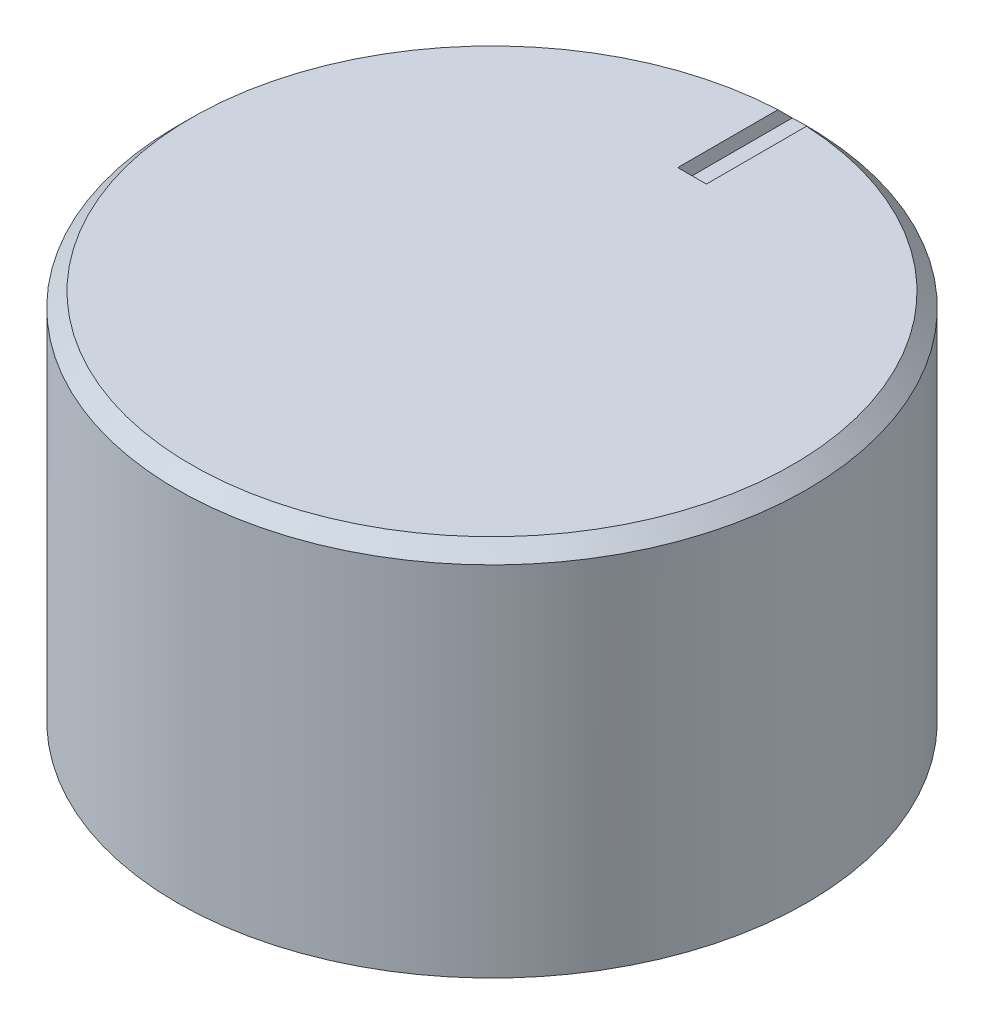
ISO-10303-21;
HEADER;
FILE_DESCRIPTION(('STEP AP214'),'2;1');
FILE_NAME('part.step','',(''),(''),'','','');
FILE_SCHEMA(('AUTOMOTIVE_DESIGN { 1 0 10303 214 1 1 1 1 }'));
ENDSEC;
DATA;
#1=APPLICATION_CONTEXT('core data for automotive mechanical design processes');
#2=APPLICATION_PROTOCOL_DEFINITION('international standard','automotive_design',2000,#1);
#3=PRODUCT_CONTEXT('',#1,'mechanical');
#4=PRODUCT('Part','Part','',(#3));
#5=PRODUCT_RELATED_PRODUCT_CATEGORY('part','',(#4));
#6=PRODUCT_DEFINITION_FORMATION('','',#4);
#7=PRODUCT_DEFINITION_CONTEXT('part definition',#1,'design');
#8=PRODUCT_DEFINITION('design','',#6,#7);
#9=PRODUCT_DEFINITION_SHAPE('','',#8);
#10=(LENGTH_UNIT() NAMED_UNIT(*) SI_UNIT(.MILLI.,.METRE.));
#11=(NAMED_UNIT(*) PLANE_ANGLE_UNIT() SI_UNIT($,.RADIAN.));
#12=(NAMED_UNIT(*) SI_UNIT($,.STERADIAN.) SOLID_ANGLE_UNIT());
#13=UNCERTAINTY_MEASURE_WITH_UNIT(LENGTH_MEASURE(1.E-05),#10,'distance_accuracy_value','');
#14=(GEOMETRIC_REPRESENTATION_CONTEXT(3) GLOBAL_UNCERTAINTY_ASSIGNED_CONTEXT((#13)) GLOBAL_UNIT_ASSIGNED_CONTEXT((#10,
#11,#12)) REPRESENTATION_CONTEXT('',''));
#15=CARTESIAN_POINT('',(0.,0.,0.));
#16=DIRECTION('',(0.,0.,1.));
#17=DIRECTION('',(1.,0.,0.));
#18=AXIS2_PLACEMENT_3D('',#15,#16,#17);
#19=CARTESIAN_POINT('',(0.,13.,0.));
#20=DIRECTION('',(0.,-1.,0.));
#21=DIRECTION('',(0.,0.,-1.));
#22=AXIS2_PLACEMENT_3D('',#19,#20,#21);
#23=CYLINDRICAL_SURFACE('',#22,11.);
#24=CARTESIAN_POINT('',(0.,12.5,0.));
#25=DIRECTION('',(0.,1.,0.));
#26=DIRECTION('',(0.,0.,1.));
#27=AXIS2_PLACEMENT_3D('',#24,#25,#26);
#28=CIRCLE('',#27,11.);
#29=CARTESIAN_POINT('',(0.5,12.5,-10.988630487918));
#30=VERTEX_POINT('',#29);
#31=CARTESIAN_POINT('',(-0.5,12.5,-10.988630487918));
#32=VERTEX_POINT('',#31);
#33=EDGE_CURVE('E93',#30,#32,#28,.T.);
#34=ORIENTED_EDGE('',*,*,#33,.F.);
#35=CARTESIAN_POINT('',(0.,12.5,0.));
#36=DIRECTION('',(0.,1.,0.));
#37=DIRECTION('',(0.,0.,1.));
#38=AXIS2_PLACEMENT_3D('',#35,#36,#37);
#39=CIRCLE('',#38,11.);
#40=EDGE_CURVE('E49',#30,#32,#39,.F.);
#41=ORIENTED_EDGE('',*,*,#40,.T.);
#42=EDGE_LOOP('',(#34,#41));
#43=FACE_BOUND('',#42,.T.);
#44=CARTESIAN_POINT('',(0.,0.,0.));
#45=DIRECTION('',(0.,1.,0.));
#46=DIRECTION('',(0.,0.,1.));
#47=AXIS2_PLACEMENT_3D('',#44,#45,#46);
#48=CIRCLE('',#47,11.);
#49=CARTESIAN_POINT('',(0.,0.,11.));
#50=VERTEX_POINT('',#49);
#51=EDGE_CURVE('E120',#50,#50,#48,.T.);
#52=ORIENTED_EDGE('',*,*,#51,.T.);
#53=EDGE_LOOP('',(#52));
#54=FACE_BOUND('',#53,.T.);
#55=ADVANCED_FACE('F36',(#43,#54),#23,.T.);
#56=CARTESIAN_POINT('',(0.,13.,0.));
#57=DIRECTION('',(0.,1.,0.));
#58=DIRECTION('',(0.,0.,1.));
#59=AXIS2_PLACEMENT_3D('',#56,#57,#58);
#60=PLANE('',#59);
#61=DIRECTION('',(0.,0.,-1.));
#62=VECTOR('',#61,1.);
#63=CARTESIAN_POINT('',(-0.499999999999999,13.,-6.98863048791795));
#64=LINE('',#63,#62);
#65=CARTESIAN_POINT('',(-0.499999999999999,13.,-6.98863048791795));
#66=VERTEX_POINT('',#65);
#67=CARTESIAN_POINT('',(-0.5,13.,-10.4880884817015));
#68=VERTEX_POINT('',#67);
#69=EDGE_CURVE('E107',#66,#68,#64,.T.);
#70=ORIENTED_EDGE('',*,*,#69,.T.);
#71=CARTESIAN_POINT('',(0.,13.,0.));
#72=DIRECTION('',(0.,1.,0.));
#73=DIRECTION('',(0.,0.,1.));
#74=AXIS2_PLACEMENT_3D('',#71,#72,#73);
#75=CIRCLE('',#74,10.5);
#76=CARTESIAN_POINT('',(0.5,13.,-10.4880884817015));
#77=VERTEX_POINT('',#76);
#78=EDGE_CURVE('E123',#68,#77,#75,.T.);
#79=ORIENTED_EDGE('',*,*,#78,.T.);
#80=DIRECTION('',(0.,0.,1.));
#81=VECTOR('',#80,1.);
#82=CARTESIAN_POINT('',(0.5,13.,-10.988630487918));
#83=LINE('',#82,#81);
#84=CARTESIAN_POINT('',(0.500000000000001,13.,-6.98863048791795));
#85=VERTEX_POINT('',#84);
#86=EDGE_CURVE('E117',#77,#85,#83,.T.);
#87=ORIENTED_EDGE('',*,*,#86,.T.);
#88=DIRECTION('',(-1.,0.,0.));
#89=VECTOR('',#88,1.);
#90=CARTESIAN_POINT('',(0.500000000000001,13.,-6.98863048791795));
#91=LINE('',#90,#89);
#92=EDGE_CURVE('E104',#85,#66,#91,.T.);
#93=ORIENTED_EDGE('',*,*,#92,.T.);
#94=EDGE_LOOP('',(#70,#79,#87,#93));
#95=FACE_BOUND('',#94,.T.);
#96=ADVANCED_FACE('F145',(#95),#60,.T.);
#97=CARTESIAN_POINT('',(0.,0.,0.));
#98=DIRECTION('',(0.,1.,0.));
#99=DIRECTION('',(0.,0.,1.));
#100=AXIS2_PLACEMENT_3D('',#97,#98,#99);
#101=PLANE('',#100);
#102=CARTESIAN_POINT('',(0.,0.,0.));
#103=DIRECTION('',(0.,-1.,0.));
#104=DIRECTION('',(0.,0.,-1.));
#105=AXIS2_PLACEMENT_3D('',#102,#103,#104);
#106=CIRCLE('',#105,3.17500000000001);
#107=CARTESIAN_POINT('',(0.,0.,-3.17500000000001));
#108=VERTEX_POINT('',#107);
#109=EDGE_CURVE('E113',#108,#108,#106,.T.);
#110=ORIENTED_EDGE('',*,*,#109,.F.);
#111=EDGE_LOOP('',(#110));
#112=FACE_BOUND('',#111,.T.);
#113=ORIENTED_EDGE('',*,*,#51,.F.);
#114=EDGE_LOOP('',(#113));
#115=FACE_BOUND('',#114,.T.);
#116=ADVANCED_FACE('F143',(#112,#115),#101,.F.);
#117=CARTESIAN_POINT('',(0.,10.,0.));
#118=DIRECTION('',(0.,1.,0.));
#119=DIRECTION('',(0.,0.,1.));
#120=AXIS2_PLACEMENT_3D('',#117,#118,#119);
#121=PLANE('',#120);
#122=CARTESIAN_POINT('',(0.,10.,0.));
#123=DIRECTION('',(0.,-1.,0.));
#124=DIRECTION('',(0.,0.,-1.));
#125=AXIS2_PLACEMENT_3D('',#122,#123,#124);
#126=CIRCLE('',#125,3.17500000000001);
#127=CARTESIAN_POINT('',(0.,10.,-3.17500000000001));
#128=VERTEX_POINT('',#127);
#129=EDGE_CURVE('E116',#128,#128,#126,.T.);
#130=ORIENTED_EDGE('',*,*,#129,.T.);
#131=EDGE_LOOP('',(#130));
#132=FACE_BOUND('',#131,.T.);
#133=ADVANCED_FACE('F139',(#132),#121,.F.);
#134=CARTESIAN_POINT('',(0.,0.,0.));
#135=DIRECTION('',(0.,-1.,0.));
#136=DIRECTION('',(0.,0.,-1.));
#137=AXIS2_PLACEMENT_3D('',#134,#135,#136);
#138=CYLINDRICAL_SURFACE('',#137,3.17500000000001);
#139=ORIENTED_EDGE('',*,*,#129,.F.);
#140=EDGE_LOOP('',(#139));
#141=FACE_BOUND('',#140,.T.);
#142=ORIENTED_EDGE('',*,*,#109,.T.);
#143=EDGE_LOOP('',(#142));
#144=FACE_BOUND('',#143,.T.);
#145=ADVANCED_FACE('F135',(#141,#144),#138,.F.);
#146=CARTESIAN_POINT('',(-0.499999999999999,55.1492882502184,-6.98863048791795));
#147=DIRECTION('',(-1.,0.,0.));
#148=DIRECTION('',(0.,0.,1.));
#149=AXIS2_PLACEMENT_3D('',#146,#147,#148);
#150=PLANE('',#149);
#151=DIRECTION('',(0.,0.,-1.));
#152=VECTOR('',#151,1.);
#153=CARTESIAN_POINT('',(-0.499999999999999,12.5,-6.98863048791795));
#154=LINE('',#153,#152);
#155=CARTESIAN_POINT('',(-0.499999999999999,12.5,-6.98863048791795));
#156=VERTEX_POINT('',#155);
#157=EDGE_CURVE('E97',#156,#32,#154,.T.);
#158=ORIENTED_EDGE('',*,*,#157,.T.);
#159=CARTESIAN_POINT('',(-0.5,12.5,-10.988630487918));
#160=CARTESIAN_POINT('',(-0.5,12.5833354375483,-10.9052089221522));
#161=CARTESIAN_POINT('',(-0.5,12.6666698229889,-10.8217863054182));
#162=CARTESIAN_POINT('',(-0.5,12.8333364896556,-10.6549389700127));
#163=CARTESIAN_POINT('',(-0.5,12.9166687708816,-10.5715142513413));
#164=CARTESIAN_POINT('',(-0.5,13.,-10.4880884817015));
#165=B_SPLINE_CURVE_WITH_KNOTS('',3,(#159,#160,#161,#162,#163,#164),.UNSPECIFIED.,.F.,.F.,(4,2,
4),(0.,0.353745070659313,0.707490141321243),.UNSPECIFIED.);
#166=EDGE_CURVE('E11',#32,#68,#165,.T.);
#167=ORIENTED_EDGE('',*,*,#166,.T.);
#168=ORIENTED_EDGE('',*,*,#69,.F.);
#169=DIRECTION('',(0.,-1.,0.));
#170=VECTOR('',#169,1.);
#171=CARTESIAN_POINT('',(-0.499999999999999,55.1492882502184,-6.98863048791795));
#172=LINE('',#171,#170);
#173=EDGE_CURVE('E105',#66,#156,#172,.T.);
#174=ORIENTED_EDGE('',*,*,#173,.T.);
#175=EDGE_LOOP('',(#158,#167,#168,#174));
#176=FACE_BOUND('',#175,.T.);
#177=ADVANCED_FACE('F138',(#176),#150,.F.);
#178=CARTESIAN_POINT('',(0.500000000000001,55.1492882502184,-6.98863048791795));
#179=DIRECTION('',(0.,0.,1.));
#180=DIRECTION('',(1.,0.,0.));
#181=AXIS2_PLACEMENT_3D('',#178,#179,#180);
#182=PLANE('',#181);
#183=DIRECTION('',(0.,-1.,0.));
#184=VECTOR('',#183,1.);
#185=CARTESIAN_POINT('',(0.500000000000001,55.1492882502184,-6.98863048791795));
#186=LINE('',#185,#184);
#187=CARTESIAN_POINT('',(0.500000000000001,12.5,-6.98863048791795));
#188=VERTEX_POINT('',#187);
#189=EDGE_CURVE('E88',#85,#188,#186,.T.);
#190=ORIENTED_EDGE('',*,*,#189,.T.);
#191=DIRECTION('',(-1.,0.,0.));
#192=VECTOR('',#191,1.);
#193=CARTESIAN_POINT('',(0.500000000000001,12.5,-6.98863048791795));
#194=LINE('',#193,#192);
#195=EDGE_CURVE('E92',#188,#156,#194,.T.);
#196=ORIENTED_EDGE('',*,*,#195,.T.);
#197=ORIENTED_EDGE('',*,*,#173,.F.);
#198=ORIENTED_EDGE('',*,*,#92,.F.);
#199=EDGE_LOOP('',(#190,#196,#197,#198));
#200=FACE_BOUND('',#199,.T.);
#201=ADVANCED_FACE('F103',(#200),#182,.F.);
#202=CARTESIAN_POINT('',(0.5,55.1492882502184,-10.988630487918));
#203=DIRECTION('',(1.,0.,0.));
#204=DIRECTION('',(0.,0.,-1.));
#205=AXIS2_PLACEMENT_3D('',#202,#203,#204);
#206=PLANE('',#205);
#207=ORIENTED_EDGE('',*,*,#86,.F.);
#208=CARTESIAN_POINT('',(0.5,13.,-10.4880884817015));
#209=CARTESIAN_POINT('',(0.5,12.9166687708816,-10.5715142513413));
#210=CARTESIAN_POINT('',(0.5,12.8333364896556,-10.6549389700127));
#211=CARTESIAN_POINT('',(0.5,12.6666698229889,-10.8217863054182));
#212=CARTESIAN_POINT('',(0.5,12.5833354375483,-10.9052089221522));
#213=CARTESIAN_POINT('',(0.5,12.5,-10.988630487918));
#214=B_SPLINE_CURVE_WITH_KNOTS('',3,(#208,#209,#210,#211,#212,#213),.UNSPECIFIED.,.F.,.F.,(4,2,
4),(0.,0.353745070661929,0.707490141321243),.UNSPECIFIED.);
#215=EDGE_CURVE('E56',#77,#30,#214,.T.);
#216=ORIENTED_EDGE('',*,*,#215,.T.);
#217=DIRECTION('',(0.,0.,1.));
#218=VECTOR('',#217,1.);
#219=CARTESIAN_POINT('',(0.5,12.5,-10.988630487918));
#220=LINE('',#219,#218);
#221=EDGE_CURVE('E83',#30,#188,#220,.T.);
#222=ORIENTED_EDGE('',*,*,#221,.T.);
#223=ORIENTED_EDGE('',*,*,#189,.F.);
#224=EDGE_LOOP('',(#207,#216,#222,#223));
#225=FACE_BOUND('',#224,.T.);
#226=ADVANCED_FACE('F86',(#225),#206,.F.);
#227=CARTESIAN_POINT('',(0.,12.5,0.));
#228=DIRECTION('',(0.,1.,0.));
#229=DIRECTION('',(0.,0.,1.));
#230=AXIS2_PLACEMENT_3D('',#227,#228,#229);
#231=PLANE('',#230);
#232=ORIENTED_EDGE('',*,*,#195,.F.);
#233=ORIENTED_EDGE('',*,*,#221,.F.);
#234=ORIENTED_EDGE('',*,*,#33,.T.);
#235=ORIENTED_EDGE('',*,*,#157,.F.);
#236=EDGE_LOOP('',(#232,#233,#234,#235));
#237=FACE_BOUND('',#236,.T.);
#238=ADVANCED_FACE('F96',(#237),#231,.T.);
#239=CARTESIAN_POINT('',(0.,13.,0.));
#240=DIRECTION('',(0.,-1.,0.));
#241=DIRECTION('',(0.,0.,-1.));
#242=AXIS2_PLACEMENT_3D('',#239,#240,#241);
#243=CONICAL_SURFACE('',#242,10.5,0.785398163397443);
#244=ORIENTED_EDGE('',*,*,#166,.F.);
#245=ORIENTED_EDGE('',*,*,#40,.F.);
#246=ORIENTED_EDGE('',*,*,#215,.F.);
#247=ORIENTED_EDGE('',*,*,#78,.F.);
#248=EDGE_LOOP('',(#244,#245,#246,#247));
#249=FACE_BOUND('',#248,.T.);
#250=ADVANCED_FACE('F38',(#249),#243,.T.);
#251=CLOSED_SHELL('',(#55,#96,#116,#133,#145,#177,#201,#226,#238,#250));
#252=MANIFOLD_SOLID_BREP('B2',#251);
#253=ADVANCED_BREP_SHAPE_REPRESENTATION('',(#18,#252),#14);
#254=SHAPE_DEFINITION_REPRESENTATION(#9,#253);
ENDSEC;
END-ISO-10303-21;
